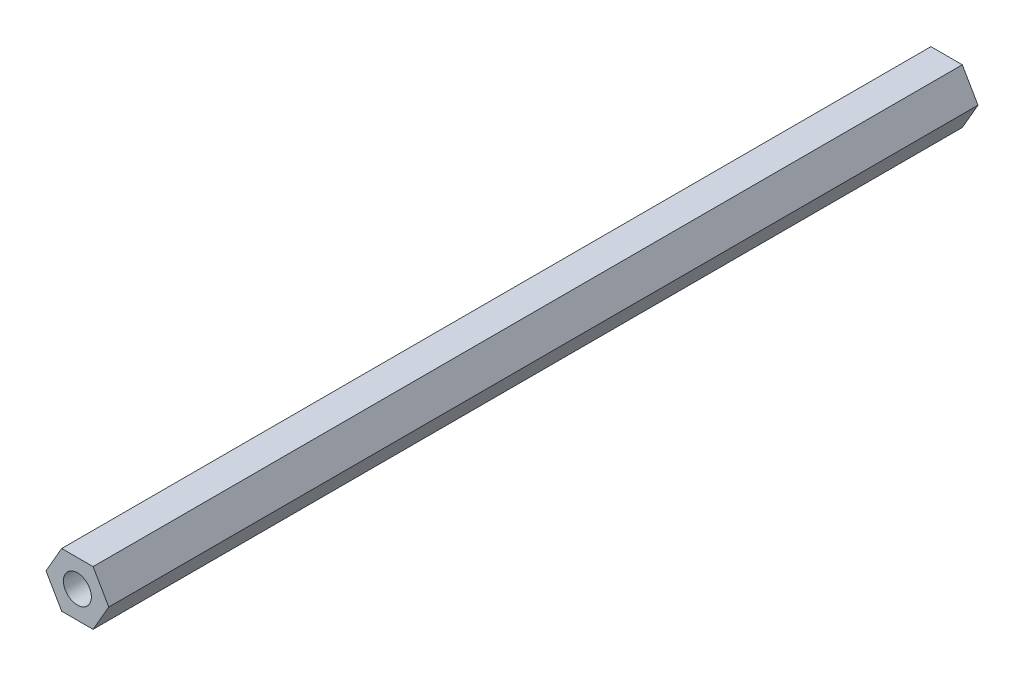
ISO-10303-21;
HEADER;
FILE_DESCRIPTION(('STEP AP214'),'2;1');
FILE_NAME('part.step','',(''),(''),'','','');
FILE_SCHEMA(('AUTOMOTIVE_DESIGN { 1 0 10303 214 1 1 1 1 }'));
ENDSEC;
DATA;
#1=APPLICATION_CONTEXT('core data for automotive mechanical design processes');
#2=APPLICATION_PROTOCOL_DEFINITION('international standard','automotive_design',2000,#1);
#3=PRODUCT_CONTEXT('',#1,'mechanical');
#4=PRODUCT('Part','Part','',(#3));
#5=PRODUCT_RELATED_PRODUCT_CATEGORY('part','',(#4));
#6=PRODUCT_DEFINITION_FORMATION('','',#4);
#7=PRODUCT_DEFINITION_CONTEXT('part definition',#1,'design');
#8=PRODUCT_DEFINITION('design','',#6,#7);
#9=PRODUCT_DEFINITION_SHAPE('','',#8);
#10=(LENGTH_UNIT() NAMED_UNIT(*) SI_UNIT(.MILLI.,.METRE.));
#11=(NAMED_UNIT(*) PLANE_ANGLE_UNIT() SI_UNIT($,.RADIAN.));
#12=(NAMED_UNIT(*) SI_UNIT($,.STERADIAN.) SOLID_ANGLE_UNIT());
#13=UNCERTAINTY_MEASURE_WITH_UNIT(LENGTH_MEASURE(1.E-05),#10,'distance_accuracy_value','');
#14=(GEOMETRIC_REPRESENTATION_CONTEXT(3) GLOBAL_UNCERTAINTY_ASSIGNED_CONTEXT((#13)) GLOBAL_UNIT_ASSIGNED_CONTEXT((#10,
#11,#12)) REPRESENTATION_CONTEXT('',''));
#15=CARTESIAN_POINT('',(0.,0.,0.));
#16=DIRECTION('',(0.,0.,1.));
#17=DIRECTION('',(1.,0.,0.));
#18=AXIS2_PLACEMENT_3D('',#15,#16,#17);
#19=CARTESIAN_POINT('',(0.,0.,203.073));
#20=DIRECTION('',(0.,0.,1.));
#21=DIRECTION('',(1.,0.,0.));
#22=AXIS2_PLACEMENT_3D('',#19,#20,#21);
#23=PLANE('',#22);
#24=DIRECTION('',(-0.499999999999995,-0.866025403784442,0.));
#25=VECTOR('',#24,1.);
#26=CARTESIAN_POINT('',(-3.6661742093542,6.34999999999996,203.073));
#27=LINE('',#26,#25);
#28=CARTESIAN_POINT('',(-3.6661742093542,6.34999999999996,203.073));
#29=VERTEX_POINT('',#28);
#30=CARTESIAN_POINT('',(-7.33234841870825,0.,203.073));
#31=VERTEX_POINT('',#30);
#32=EDGE_CURVE('E128',#29,#31,#27,.T.);
#33=ORIENTED_EDGE('',*,*,#32,.T.);
#34=DIRECTION('',(0.500000000000001,-0.866025403784438,0.));
#35=VECTOR('',#34,1.);
#36=CARTESIAN_POINT('',(-7.33234841870825,0.,203.073));
#37=LINE('',#36,#35);
#38=CARTESIAN_POINT('',(-3.66617420935411,-6.35000000000001,203.073));
#39=VERTEX_POINT('',#38);
#40=EDGE_CURVE('E86',#31,#39,#37,.T.);
#41=ORIENTED_EDGE('',*,*,#40,.T.);
#42=DIRECTION('',(1.,0.,0.));
#43=VECTOR('',#42,1.);
#44=CARTESIAN_POINT('',(-3.66617420935411,-6.35000000000001,203.073));
#45=LINE('',#44,#43);
#46=CARTESIAN_POINT('',(3.66617420935415,-6.34999999999998,203.073));
#47=VERTEX_POINT('',#46);
#48=EDGE_CURVE('E99',#39,#47,#45,.T.);
#49=ORIENTED_EDGE('',*,*,#48,.T.);
#50=DIRECTION('',(0.499999999999995,0.866025403784442,0.));
#51=VECTOR('',#50,1.);
#52=CARTESIAN_POINT('',(3.66617420935415,-6.34999999999998,203.073));
#53=LINE('',#52,#51);
#54=CARTESIAN_POINT('',(7.33234841870825,0.,203.073));
#55=VERTEX_POINT('',#54);
#56=EDGE_CURVE('E93',#47,#55,#53,.T.);
#57=ORIENTED_EDGE('',*,*,#56,.T.);
#58=DIRECTION('',(-0.500000000000007,0.866025403784434,0.));
#59=VECTOR('',#58,1.);
#60=CARTESIAN_POINT('',(7.33234841870825,0.,203.073));
#61=LINE('',#60,#59);
#62=CARTESIAN_POINT('',(3.66617420935407,6.35000000000003,203.073));
#63=VERTEX_POINT('',#62);
#64=EDGE_CURVE('E97',#55,#63,#61,.T.);
#65=ORIENTED_EDGE('',*,*,#64,.T.);
#66=DIRECTION('',(-1.,0.,0.));
#67=VECTOR('',#66,1.);
#68=CARTESIAN_POINT('',(3.66617420935407,6.35000000000003,203.073));
#69=LINE('',#68,#67);
#70=EDGE_CURVE('E49',#63,#29,#69,.T.);
#71=ORIENTED_EDGE('',*,*,#70,.T.);
#72=EDGE_LOOP('',(#33,#41,#49,#57,#65,#71));
#73=FACE_BOUND('',#72,.T.);
#74=CARTESIAN_POINT('',(0.,0.,203.073));
#75=DIRECTION('',(0.,0.,1.));
#76=DIRECTION('',(1.,0.,0.));
#77=AXIS2_PLACEMENT_3D('',#74,#75,#76);
#78=CIRCLE('',#77,3.2639);
#79=CARTESIAN_POINT('',(3.2639,0.,203.073));
#80=VERTEX_POINT('',#79);
#81=EDGE_CURVE('E121',#80,#80,#78,.T.);
#82=ORIENTED_EDGE('',*,*,#81,.F.);
#83=EDGE_LOOP('',(#82));
#84=FACE_BOUND('',#83,.T.);
#85=ADVANCED_FACE('F32',(#73,#84),#23,.T.);
#86=CARTESIAN_POINT('',(0.,0.,0.));
#87=DIRECTION('',(0.,0.,1.));
#88=DIRECTION('',(1.,0.,0.));
#89=AXIS2_PLACEMENT_3D('',#86,#87,#88);
#90=PLANE('',#89);
#91=DIRECTION('',(-0.499999999999995,-0.866025403784442,0.));
#92=VECTOR('',#91,1.);
#93=CARTESIAN_POINT('',(-3.6661742093542,6.34999999999996,0.));
#94=LINE('',#93,#92);
#95=CARTESIAN_POINT('',(-3.6661742093542,6.34999999999996,0.));
#96=VERTEX_POINT('',#95);
#97=CARTESIAN_POINT('',(-7.33234841870825,0.,0.));
#98=VERTEX_POINT('',#97);
#99=EDGE_CURVE('E117',#96,#98,#94,.T.);
#100=ORIENTED_EDGE('',*,*,#99,.F.);
#101=DIRECTION('',(-1.,0.,0.));
#102=VECTOR('',#101,1.);
#103=CARTESIAN_POINT('',(3.66617420935407,6.35000000000003,0.));
#104=LINE('',#103,#102);
#105=CARTESIAN_POINT('',(3.66617420935407,6.35000000000003,0.));
#106=VERTEX_POINT('',#105);
#107=EDGE_CURVE('E78',#106,#96,#104,.T.);
#108=ORIENTED_EDGE('',*,*,#107,.F.);
#109=DIRECTION('',(-0.500000000000007,0.866025403784434,0.));
#110=VECTOR('',#109,1.);
#111=CARTESIAN_POINT('',(7.33234841870825,0.,0.));
#112=LINE('',#111,#110);
#113=CARTESIAN_POINT('',(7.33234841870825,0.,0.));
#114=VERTEX_POINT('',#113);
#115=EDGE_CURVE('E72',#114,#106,#112,.T.);
#116=ORIENTED_EDGE('',*,*,#115,.F.);
#117=DIRECTION('',(0.499999999999995,0.866025403784442,0.));
#118=VECTOR('',#117,1.);
#119=CARTESIAN_POINT('',(3.66617420935415,-6.34999999999998,0.));
#120=LINE('',#119,#118);
#121=CARTESIAN_POINT('',(3.66617420935415,-6.34999999999998,0.));
#122=VERTEX_POINT('',#121);
#123=EDGE_CURVE('E107',#122,#114,#120,.T.);
#124=ORIENTED_EDGE('',*,*,#123,.F.);
#125=DIRECTION('',(1.,0.,0.));
#126=VECTOR('',#125,1.);
#127=CARTESIAN_POINT('',(-3.66617420935411,-6.35000000000001,0.));
#128=LINE('',#127,#126);
#129=CARTESIAN_POINT('',(-3.66617420935411,-6.35000000000001,0.));
#130=VERTEX_POINT('',#129);
#131=EDGE_CURVE('E123',#130,#122,#128,.T.);
#132=ORIENTED_EDGE('',*,*,#131,.F.);
#133=DIRECTION('',(0.500000000000001,-0.866025403784438,0.));
#134=VECTOR('',#133,1.);
#135=CARTESIAN_POINT('',(-7.33234841870825,0.,0.));
#136=LINE('',#135,#134);
#137=EDGE_CURVE('E120',#98,#130,#136,.T.);
#138=ORIENTED_EDGE('',*,*,#137,.F.);
#139=EDGE_LOOP('',(#100,#108,#116,#124,#132,#138));
#140=FACE_BOUND('',#139,.T.);
#141=CARTESIAN_POINT('',(0.,0.,0.));
#142=DIRECTION('',(0.,0.,1.));
#143=DIRECTION('',(1.,0.,0.));
#144=AXIS2_PLACEMENT_3D('',#141,#142,#143);
#145=CIRCLE('',#144,3.2639);
#146=CARTESIAN_POINT('',(3.2639,0.,0.));
#147=VERTEX_POINT('',#146);
#148=EDGE_CURVE('E221',#147,#147,#145,.T.);
#149=ORIENTED_EDGE('',*,*,#148,.T.);
#150=EDGE_LOOP('',(#149));
#151=FACE_BOUND('',#150,.T.);
#152=ADVANCED_FACE('F137',(#140,#151),#90,.F.);
#153=CARTESIAN_POINT('',(-3.6661742093542,6.34999999999996,203.073));
#154=DIRECTION('',(0.866025403784442,-0.499999999999995,0.));
#155=DIRECTION('',(0.499999999999995,0.866025403784442,0.));
#156=AXIS2_PLACEMENT_3D('',#153,#154,#155);
#157=PLANE('',#156);
#158=ORIENTED_EDGE('',*,*,#99,.T.);
#159=DIRECTION('',(0.,0.,-1.));
#160=VECTOR('',#159,1.);
#161=CARTESIAN_POINT('',(-7.33234841870825,0.,203.073));
#162=LINE('',#161,#160);
#163=EDGE_CURVE('E11',#31,#98,#162,.T.);
#164=ORIENTED_EDGE('',*,*,#163,.F.);
#165=ORIENTED_EDGE('',*,*,#32,.F.);
#166=DIRECTION('',(0.,0.,-1.));
#167=VECTOR('',#166,1.);
#168=CARTESIAN_POINT('',(-3.6661742093542,6.34999999999996,203.073));
#169=LINE('',#168,#167);
#170=EDGE_CURVE('E113',#29,#96,#169,.T.);
#171=ORIENTED_EDGE('',*,*,#170,.T.);
#172=EDGE_LOOP('',(#158,#164,#165,#171));
#173=FACE_BOUND('',#172,.T.);
#174=ADVANCED_FACE('F34',(#173),#157,.F.);
#175=CARTESIAN_POINT('',(-7.33234841870825,0.,203.073));
#176=DIRECTION('',(0.866025403784438,0.500000000000001,0.));
#177=DIRECTION('',(-0.500000000000001,0.866025403784438,0.));
#178=AXIS2_PLACEMENT_3D('',#175,#176,#177);
#179=PLANE('',#178);
#180=ORIENTED_EDGE('',*,*,#137,.T.);
#181=DIRECTION('',(0.,0.,-1.));
#182=VECTOR('',#181,1.);
#183=CARTESIAN_POINT('',(-3.66617420935411,-6.35000000000001,203.073));
#184=LINE('',#183,#182);
#185=EDGE_CURVE('E41',#39,#130,#184,.T.);
#186=ORIENTED_EDGE('',*,*,#185,.F.);
#187=ORIENTED_EDGE('',*,*,#40,.F.);
#188=ORIENTED_EDGE('',*,*,#163,.T.);
#189=EDGE_LOOP('',(#180,#186,#187,#188));
#190=FACE_BOUND('',#189,.T.);
#191=ADVANCED_FACE('F162',(#190),#179,.F.);
#192=CARTESIAN_POINT('',(-3.66617420935411,-6.35000000000001,203.073));
#193=DIRECTION('',(0.,1.,0.));
#194=DIRECTION('',(-1.,0.,0.));
#195=AXIS2_PLACEMENT_3D('',#192,#193,#194);
#196=PLANE('',#195);
#197=ORIENTED_EDGE('',*,*,#131,.T.);
#198=DIRECTION('',(0.,0.,-1.));
#199=VECTOR('',#198,1.);
#200=CARTESIAN_POINT('',(3.66617420935415,-6.34999999999998,203.073));
#201=LINE('',#200,#199);
#202=EDGE_CURVE('E108',#47,#122,#201,.T.);
#203=ORIENTED_EDGE('',*,*,#202,.F.);
#204=ORIENTED_EDGE('',*,*,#48,.F.);
#205=ORIENTED_EDGE('',*,*,#185,.T.);
#206=EDGE_LOOP('',(#197,#203,#204,#205));
#207=FACE_BOUND('',#206,.T.);
#208=ADVANCED_FACE('F134',(#207),#196,.F.);
#209=CARTESIAN_POINT('',(3.66617420935415,-6.34999999999998,203.073));
#210=DIRECTION('',(-0.866025403784441,0.499999999999995,0.));
#211=DIRECTION('',(-0.499999999999995,-0.866025403784442,0.));
#212=AXIS2_PLACEMENT_3D('',#209,#210,#211);
#213=PLANE('',#212);
#214=ORIENTED_EDGE('',*,*,#123,.T.);
#215=DIRECTION('',(0.,0.,-1.));
#216=VECTOR('',#215,1.);
#217=CARTESIAN_POINT('',(7.33234841870825,0.,203.073));
#218=LINE('',#217,#216);
#219=EDGE_CURVE('E104',#55,#114,#218,.T.);
#220=ORIENTED_EDGE('',*,*,#219,.F.);
#221=ORIENTED_EDGE('',*,*,#56,.F.);
#222=ORIENTED_EDGE('',*,*,#202,.T.);
#223=EDGE_LOOP('',(#214,#220,#221,#222));
#224=FACE_BOUND('',#223,.T.);
#225=ADVANCED_FACE('F105',(#224),#213,.F.);
#226=CARTESIAN_POINT('',(7.33234841870825,0.,203.073));
#227=DIRECTION('',(-0.866025403784435,-0.500000000000007,0.));
#228=DIRECTION('',(0.500000000000007,-0.866025403784435,0.));
#229=AXIS2_PLACEMENT_3D('',#226,#227,#228);
#230=PLANE('',#229);
#231=ORIENTED_EDGE('',*,*,#115,.T.);
#232=DIRECTION('',(0.,0.,-1.));
#233=VECTOR('',#232,1.);
#234=CARTESIAN_POINT('',(3.66617420935407,6.35000000000003,203.073));
#235=LINE('',#234,#233);
#236=EDGE_CURVE('E109',#63,#106,#235,.T.);
#237=ORIENTED_EDGE('',*,*,#236,.F.);
#238=ORIENTED_EDGE('',*,*,#64,.F.);
#239=ORIENTED_EDGE('',*,*,#219,.T.);
#240=EDGE_LOOP('',(#231,#237,#238,#239));
#241=FACE_BOUND('',#240,.T.);
#242=ADVANCED_FACE('F111',(#241),#230,.F.);
#243=CARTESIAN_POINT('',(3.66617420935407,6.35000000000003,203.073));
#244=DIRECTION('',(0.,-1.,0.));
#245=DIRECTION('',(1.,0.,0.));
#246=AXIS2_PLACEMENT_3D('',#243,#244,#245);
#247=PLANE('',#246);
#248=ORIENTED_EDGE('',*,*,#107,.T.);
#249=ORIENTED_EDGE('',*,*,#170,.F.);
#250=ORIENTED_EDGE('',*,*,#70,.F.);
#251=ORIENTED_EDGE('',*,*,#236,.T.);
#252=EDGE_LOOP('',(#248,#249,#250,#251));
#253=FACE_BOUND('',#252,.T.);
#254=ADVANCED_FACE('F142',(#253),#247,.F.);
#255=CARTESIAN_POINT('',(0.,0.,203.073));
#256=DIRECTION('',(0.,0.,-1.));
#257=DIRECTION('',(-1.,0.,0.));
#258=AXIS2_PLACEMENT_3D('',#255,#256,#257);
#259=CYLINDRICAL_SURFACE('',#258,3.2639);
#260=ORIENTED_EDGE('',*,*,#81,.T.);
#261=EDGE_LOOP('',(#260));
#262=FACE_BOUND('',#261,.T.);
#263=ORIENTED_EDGE('',*,*,#148,.F.);
#264=EDGE_LOOP('',(#263));
#265=FACE_BOUND('',#264,.T.);
#266=ADVANCED_FACE('F144',(#262,#265),#259,.F.);
#267=CLOSED_SHELL('',(#85,#152,#174,#191,#208,#225,#242,#254,#266));
#268=MANIFOLD_SOLID_BREP('B2',#267);
#269=ADVANCED_BREP_SHAPE_REPRESENTATION('',(#18,#268),#14);
#270=SHAPE_DEFINITION_REPRESENTATION(#9,#269);
ENDSEC;
END-ISO-10303-21;
